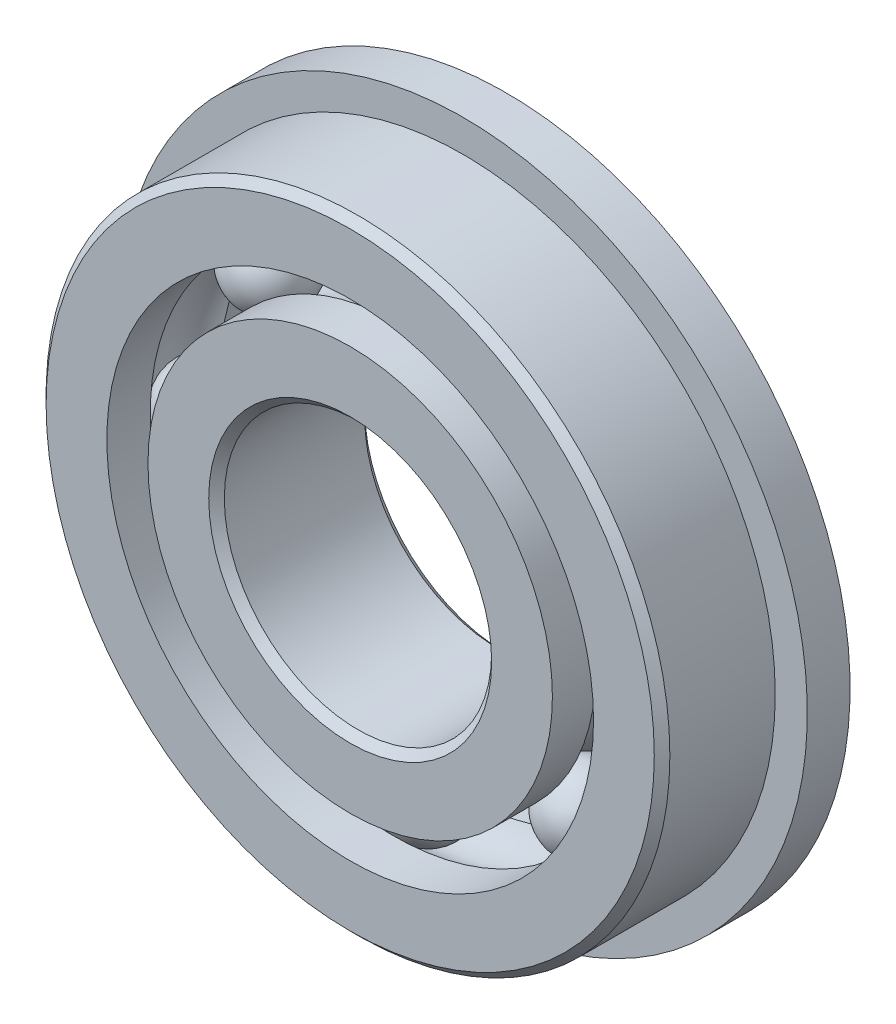
ISO-10303-21;
HEADER;
FILE_DESCRIPTION(('STEP AP214'),'2;1');
FILE_NAME('part.step','',(''),(''),'','','');
FILE_SCHEMA(('AUTOMOTIVE_DESIGN { 1 0 10303 214 1 1 1 1 }'));
ENDSEC;
DATA;
#1=APPLICATION_CONTEXT('core data for automotive mechanical design processes');
#2=APPLICATION_PROTOCOL_DEFINITION('international standard','automotive_design',2000,#1);
#3=PRODUCT_CONTEXT('',#1,'mechanical');
#4=PRODUCT('Part','Part','',(#3));
#5=PRODUCT_RELATED_PRODUCT_CATEGORY('part','',(#4));
#6=PRODUCT_DEFINITION_FORMATION('','',#4);
#7=PRODUCT_DEFINITION_CONTEXT('part definition',#1,'design');
#8=PRODUCT_DEFINITION('design','',#6,#7);
#9=PRODUCT_DEFINITION_SHAPE('','',#8);
#10=(LENGTH_UNIT() NAMED_UNIT(*) SI_UNIT(.MILLI.,.METRE.));
#11=(NAMED_UNIT(*) PLANE_ANGLE_UNIT() SI_UNIT($,.RADIAN.));
#12=(NAMED_UNIT(*) SI_UNIT($,.STERADIAN.) SOLID_ANGLE_UNIT());
#13=UNCERTAINTY_MEASURE_WITH_UNIT(LENGTH_MEASURE(1.E-05),#10,'distance_accuracy_value','');
#14=(GEOMETRIC_REPRESENTATION_CONTEXT(3) GLOBAL_UNCERTAINTY_ASSIGNED_CONTEXT((#13)) GLOBAL_UNIT_ASSIGNED_CONTEXT((#10,
#11,#12)) REPRESENTATION_CONTEXT('',''));
#15=CARTESIAN_POINT('',(0.,0.,0.));
#16=DIRECTION('',(0.,0.,1.));
#17=DIRECTION('',(1.,0.,0.));
#18=AXIS2_PLACEMENT_3D('',#15,#16,#17);
#19=CARTESIAN_POINT('',(-5.61266007566815,5.61266007566829,0.));
#20=DIRECTION('',(0.,0.,1.));
#21=DIRECTION('',(-0.707106781186539,0.707106781186556,0.));
#22=AXIS2_PLACEMENT_3D('',#19,#20,#21);
#23=SPHERICAL_SURFACE('',#22,1.43574962434293);
#24=CARTESIAN_POINT('',(-5.61266007566815,5.61266007566829,1.43574962434293));
#25=VERTEX_POINT('',#24);
#26=VERTEX_LOOP('',#25);
#27=FACE_BOUND('',#26,.T.);
#28=ADVANCED_FACE('F39',(#27),#23,.T.);
#29=CLOSED_SHELL('',(#28));
#30=MANIFOLD_SOLID_BREP('B2',#29);
#31=CARTESIAN_POINT('',(-7.9375,0.,0.));
#32=DIRECTION('',(0.,0.,1.));
#33=DIRECTION('',(-1.,0.,0.));
#34=AXIS2_PLACEMENT_3D('',#31,#32,#33);
#35=SPHERICAL_SURFACE('',#34,1.43574962434293);
#36=CARTESIAN_POINT('',(-7.9375,0.,1.43574962434293));
#37=VERTEX_POINT('',#36);
#38=VERTEX_LOOP('',#37);
#39=FACE_BOUND('',#38,.T.);
#40=ADVANCED_FACE('F59',(#39),#35,.T.);
#41=CLOSED_SHELL('',(#40));
#42=MANIFOLD_SOLID_BREP('B6',#41);
#43=CARTESIAN_POINT('',(-5.61266007566827,-5.61266007566817,0.));
#44=DIRECTION('',(0.,0.,1.));
#45=DIRECTION('',(-0.707106781186554,-0.707106781186541,0.));
#46=AXIS2_PLACEMENT_3D('',#43,#44,#45);
#47=SPHERICAL_SURFACE('',#46,1.43574962434293);
#48=CARTESIAN_POINT('',(-5.61266007566827,-5.61266007566817,1.43574962434293));
#49=VERTEX_POINT('',#48);
#50=VERTEX_LOOP('',#49);
#51=FACE_BOUND('',#50,.T.);
#52=ADVANCED_FACE('F79',(#51),#47,.T.);
#53=CLOSED_SHELL('',(#52));
#54=MANIFOLD_SOLID_BREP('B35',#53);
#55=CARTESIAN_POINT('',(0.,-7.9375,0.));
#56=DIRECTION('',(0.,0.,1.));
#57=DIRECTION('',(0.,-1.,0.));
#58=AXIS2_PLACEMENT_3D('',#55,#56,#57);
#59=SPHERICAL_SURFACE('',#58,1.43574962434293);
#60=CARTESIAN_POINT('',(0.,-7.9375,1.43574962434293));
#61=VERTEX_POINT('',#60);
#62=VERTEX_LOOP('',#61);
#63=FACE_BOUND('',#62,.T.);
#64=ADVANCED_FACE('F99',(#63),#59,.T.);
#65=CLOSED_SHELL('',(#64));
#66=MANIFOLD_SOLID_BREP('B55',#65);
#67=CARTESIAN_POINT('',(5.61266007566819,-5.61266007566825,0.));
#68=DIRECTION('',(0.,0.,1.));
#69=DIRECTION('',(0.707106781186544,-0.707106781186551,0.));
#70=AXIS2_PLACEMENT_3D('',#67,#68,#69);
#71=SPHERICAL_SURFACE('',#70,1.43574962434293);
#72=CARTESIAN_POINT('',(5.61266007566819,-5.61266007566825,1.43574962434293));
#73=VERTEX_POINT('',#72);
#74=VERTEX_LOOP('',#73);
#75=FACE_BOUND('',#74,.T.);
#76=ADVANCED_FACE('F119',(#75),#71,.T.);
#77=CLOSED_SHELL('',(#76));
#78=MANIFOLD_SOLID_BREP('B75',#77);
#79=CARTESIAN_POINT('',(7.9375,0.,0.));
#80=DIRECTION('',(0.,0.,1.));
#81=DIRECTION('',(1.,0.,0.));
#82=AXIS2_PLACEMENT_3D('',#79,#80,#81);
#83=SPHERICAL_SURFACE('',#82,1.43574962434293);
#84=CARTESIAN_POINT('',(7.9375,0.,1.43574962434293));
#85=VERTEX_POINT('',#84);
#86=VERTEX_LOOP('',#85);
#87=FACE_BOUND('',#86,.T.);
#88=ADVANCED_FACE('F139',(#87),#83,.T.);
#89=CLOSED_SHELL('',(#88));
#90=MANIFOLD_SOLID_BREP('B95',#89);
#91=CARTESIAN_POINT('',(5.61266007566823,5.61266007566821,0.));
#92=DIRECTION('',(0.,0.,1.));
#93=DIRECTION('',(0.707106781186549,0.707106781186546,0.));
#94=AXIS2_PLACEMENT_3D('',#91,#92,#93);
#95=SPHERICAL_SURFACE('',#94,1.43574962434293);
#96=CARTESIAN_POINT('',(5.61266007566823,5.61266007566821,1.43574962434293));
#97=VERTEX_POINT('',#96);
#98=VERTEX_LOOP('',#97);
#99=FACE_BOUND('',#98,.T.);
#100=ADVANCED_FACE('F159',(#99),#95,.T.);
#101=CLOSED_SHELL('',(#100));
#102=MANIFOLD_SOLID_BREP('B115',#101);
#103=CARTESIAN_POINT('',(0.,7.9375,0.));
#104=DIRECTION('',(0.,0.,1.));
#105=DIRECTION('',(0.,1.,0.));
#106=AXIS2_PLACEMENT_3D('',#103,#104,#105);
#107=SPHERICAL_SURFACE('',#106,1.43574962434293);
#108=CARTESIAN_POINT('',(0.,7.9375,1.43574962434293));
#109=VERTEX_POINT('',#108);
#110=VERTEX_LOOP('',#109);
#111=FACE_BOUND('',#110,.T.);
#112=ADVANCED_FACE('F181',(#111),#107,.T.);
#113=CLOSED_SHELL('',(#112));
#114=MANIFOLD_SOLID_BREP('B135',#113);
#115=CARTESIAN_POINT('',(0.,7.20480769230769,2.778125));
#116=DIRECTION('',(0.,0.,-1.));
#117=DIRECTION('',(-1.,0.,0.));
#118=AXIS2_PLACEMENT_3D('',#115,#116,#117);
#119=PLANE('',#118);
#120=CARTESIAN_POINT('',(0.,0.,2.778125));
#121=DIRECTION('',(0.,0.,1.));
#122=DIRECTION('',(1.,0.,0.));
#123=AXIS2_PLACEMENT_3D('',#120,#121,#122);
#124=CIRCLE('',#123,5.0403125);
#125=CARTESIAN_POINT('',(5.0403125,0.,2.778125));
#126=VERTEX_POINT('',#125);
#127=EDGE_CURVE('E228',#126,#126,#124,.T.);
#128=ORIENTED_EDGE('',*,*,#127,.F.);
#129=EDGE_LOOP('',(#128));
#130=FACE_BOUND('',#129,.T.);
#131=CARTESIAN_POINT('',(0.,0.,2.778125));
#132=DIRECTION('',(0.,0.,1.));
#133=DIRECTION('',(1.,0.,0.));
#134=AXIS2_PLACEMENT_3D('',#131,#132,#133);
#135=CIRCLE('',#134,7.20480769230769);
#136=CARTESIAN_POINT('',(7.20480769230769,0.,2.778125));
#137=VERTEX_POINT('',#136);
#138=EDGE_CURVE('E180',#137,#137,#135,.T.);
#139=ORIENTED_EDGE('',*,*,#138,.T.);
#140=EDGE_LOOP('',(#139));
#141=FACE_BOUND('',#140,.T.);
#142=ADVANCED_FACE('F200',(#130,#141),#119,.F.);
#143=CARTESIAN_POINT('',(0.,0.,2.778125));
#144=DIRECTION('',(0.,0.,1.));
#145=DIRECTION('',(1.,0.,0.));
#146=AXIS2_PLACEMENT_3D('',#143,#144,#145);
#147=CYLINDRICAL_SURFACE('',#146,7.20480769230769);
#148=ORIENTED_EDGE('',*,*,#138,.F.);
#149=EDGE_LOOP('',(#148));
#150=FACE_BOUND('',#149,.T.);
#151=CARTESIAN_POINT('',(0.,0.,1.23472222222222));
#152=DIRECTION('',(0.,0.,1.));
#153=DIRECTION('',(1.,0.,0.));
#154=AXIS2_PLACEMENT_3D('',#151,#152,#153);
#155=CIRCLE('',#154,7.20480769230769);
#156=CARTESIAN_POINT('',(7.20480769230769,0.,1.23472222222222));
#157=VERTEX_POINT('',#156);
#158=EDGE_CURVE('E206',#157,#157,#155,.T.);
#159=ORIENTED_EDGE('',*,*,#158,.T.);
#160=EDGE_LOOP('',(#159));
#161=FACE_BOUND('',#160,.T.);
#162=ADVANCED_FACE('F235',(#150,#161),#147,.T.);
#163=CARTESIAN_POINT('',(0.,0.,0.));
#164=DIRECTION('',(0.,0.,1.));
#165=DIRECTION('',(1.,0.,0.));
#166=AXIS2_PLACEMENT_3D('',#163,#164,#165);
#167=TOROIDAL_SURFACE('',#166,7.93749999999999,1.43574962434293);
#168=ORIENTED_EDGE('',*,*,#158,.F.);
#169=EDGE_LOOP('',(#168));
#170=FACE_BOUND('',#169,.T.);
#171=CARTESIAN_POINT('',(0.,0.,-1.23472222222222));
#172=DIRECTION('',(0.,0.,1.));
#173=DIRECTION('',(1.,0.,0.));
#174=AXIS2_PLACEMENT_3D('',#171,#172,#173);
#175=CIRCLE('',#174,7.20480769230769);
#176=CARTESIAN_POINT('',(7.20480769230769,0.,-1.23472222222222));
#177=VERTEX_POINT('',#176);
#178=EDGE_CURVE('E210',#177,#177,#175,.T.);
#179=ORIENTED_EDGE('',*,*,#178,.T.);
#180=EDGE_LOOP('',(#179));
#181=FACE_BOUND('',#180,.T.);
#182=ADVANCED_FACE('F239',(#170,#181),#167,.F.);
#183=CARTESIAN_POINT('',(0.,0.,2.778125));
#184=DIRECTION('',(0.,0.,1.));
#185=DIRECTION('',(1.,0.,0.));
#186=AXIS2_PLACEMENT_3D('',#183,#184,#185);
#187=CYLINDRICAL_SURFACE('',#186,7.20480769230769);
#188=ORIENTED_EDGE('',*,*,#178,.F.);
#189=EDGE_LOOP('',(#188));
#190=FACE_BOUND('',#189,.T.);
#191=CARTESIAN_POINT('',(0.,0.,-2.778125));
#192=DIRECTION('',(0.,0.,1.));
#193=DIRECTION('',(1.,0.,0.));
#194=AXIS2_PLACEMENT_3D('',#191,#192,#193);
#195=CIRCLE('',#194,7.20480769230769);
#196=CARTESIAN_POINT('',(7.20480769230769,0.,-2.778125));
#197=VERTEX_POINT('',#196);
#198=EDGE_CURVE('E214',#197,#197,#195,.T.);
#199=ORIENTED_EDGE('',*,*,#198,.T.);
#200=EDGE_LOOP('',(#199));
#201=FACE_BOUND('',#200,.T.);
#202=ADVANCED_FACE('F244',(#190,#201),#187,.T.);
#203=CARTESIAN_POINT('',(0.,5.0403125,-2.778125));
#204=DIRECTION('',(0.,0.,1.));
#205=DIRECTION('',(1.,0.,0.));
#206=AXIS2_PLACEMENT_3D('',#203,#204,#205);
#207=PLANE('',#206);
#208=ORIENTED_EDGE('',*,*,#198,.F.);
#209=EDGE_LOOP('',(#208));
#210=FACE_BOUND('',#209,.T.);
#211=CARTESIAN_POINT('',(0.,0.,-2.778125));
#212=DIRECTION('',(0.,0.,1.));
#213=DIRECTION('',(1.,0.,0.));
#214=AXIS2_PLACEMENT_3D('',#211,#212,#213);
#215=CIRCLE('',#214,5.0403125);
#216=CARTESIAN_POINT('',(5.0403125,0.,-2.778125));
#217=VERTEX_POINT('',#216);
#218=EDGE_CURVE('E219',#217,#217,#215,.T.);
#219=ORIENTED_EDGE('',*,*,#218,.T.);
#220=EDGE_LOOP('',(#219));
#221=FACE_BOUND('',#220,.T.);
#222=ADVANCED_FACE('F250',(#210,#221),#207,.F.);
#223=CARTESIAN_POINT('',(0.,0.,-2.5003125));
#224=DIRECTION('',(0.,0.,-1.));
#225=DIRECTION('',(-1.,0.,0.));
#226=AXIS2_PLACEMENT_3D('',#223,#224,#225);
#227=CONICAL_SURFACE('',#226,4.7625,0.785398163397442);
#228=ORIENTED_EDGE('',*,*,#218,.F.);
#229=EDGE_LOOP('',(#228));
#230=FACE_BOUND('',#229,.T.);
#231=CARTESIAN_POINT('',(0.,0.,-2.5003125));
#232=DIRECTION('',(0.,0.,1.));
#233=DIRECTION('',(1.,0.,0.));
#234=AXIS2_PLACEMENT_3D('',#231,#232,#233);
#235=CIRCLE('',#234,4.7625);
#236=CARTESIAN_POINT('',(4.7625,0.,-2.5003125));
#237=VERTEX_POINT('',#236);
#238=EDGE_CURVE('E222',#237,#237,#235,.T.);
#239=ORIENTED_EDGE('',*,*,#238,.T.);
#240=EDGE_LOOP('',(#239));
#241=FACE_BOUND('',#240,.T.);
#242=ADVANCED_FACE('F254',(#230,#241),#227,.F.);
#243=CARTESIAN_POINT('',(0.,0.,2.778125));
#244=DIRECTION('',(0.,0.,1.));
#245=DIRECTION('',(1.,0.,0.));
#246=AXIS2_PLACEMENT_3D('',#243,#244,#245);
#247=CYLINDRICAL_SURFACE('',#246,4.7625);
#248=ORIENTED_EDGE('',*,*,#238,.F.);
#249=EDGE_LOOP('',(#248));
#250=FACE_BOUND('',#249,.T.);
#251=CARTESIAN_POINT('',(0.,0.,2.5003125));
#252=DIRECTION('',(0.,0.,1.));
#253=DIRECTION('',(1.,0.,0.));
#254=AXIS2_PLACEMENT_3D('',#251,#252,#253);
#255=CIRCLE('',#254,4.7625);
#256=CARTESIAN_POINT('',(4.7625,0.,2.5003125));
#257=VERTEX_POINT('',#256);
#258=EDGE_CURVE('E225',#257,#257,#255,.T.);
#259=ORIENTED_EDGE('',*,*,#258,.T.);
#260=EDGE_LOOP('',(#259));
#261=FACE_BOUND('',#260,.T.);
#262=ADVANCED_FACE('F258',(#250,#261),#247,.F.);
#263=CARTESIAN_POINT('',(0.,0.,2.778125));
#264=DIRECTION('',(0.,0.,1.));
#265=DIRECTION('',(1.,0.,0.));
#266=AXIS2_PLACEMENT_3D('',#263,#264,#265);
#267=CONICAL_SURFACE('',#266,5.0403125,0.785398163397453);
#268=ORIENTED_EDGE('',*,*,#258,.F.);
#269=EDGE_LOOP('',(#268));
#270=FACE_BOUND('',#269,.T.);
#271=ORIENTED_EDGE('',*,*,#127,.T.);
#272=EDGE_LOOP('',(#271));
#273=FACE_BOUND('',#272,.T.);
#274=ADVANCED_FACE('F232',(#270,#273),#267,.F.);
#275=CLOSED_SHELL('',(#142,#162,#182,#202,#222,#242,#262,#274));
#276=MANIFOLD_SOLID_BREP('B155',#275);
#277=CARTESIAN_POINT('',(0.,0.,2.5003125));
#278=DIRECTION('',(0.,0.,-1.));
#279=DIRECTION('',(-1.,0.,0.));
#280=AXIS2_PLACEMENT_3D('',#277,#278,#279);
#281=CONICAL_SURFACE('',#280,11.1125,0.785398163397446);
#282=CARTESIAN_POINT('',(0.,0.,2.778125));
#283=DIRECTION('',(0.,0.,1.));
#284=DIRECTION('',(1.,0.,0.));
#285=AXIS2_PLACEMENT_3D('',#282,#283,#284);
#286=CIRCLE('',#285,10.8346875);
#287=CARTESIAN_POINT('',(10.8346875,0.,2.778125));
#288=VERTEX_POINT('',#287);
#289=EDGE_CURVE('E343',#288,#288,#286,.T.);
#290=ORIENTED_EDGE('',*,*,#289,.F.);
#291=EDGE_LOOP('',(#290));
#292=FACE_BOUND('',#291,.T.);
#293=CARTESIAN_POINT('',(0.,0.,2.5003125));
#294=DIRECTION('',(0.,0.,1.));
#295=DIRECTION('',(1.,0.,0.));
#296=AXIS2_PLACEMENT_3D('',#293,#294,#295);
#297=CIRCLE('',#296,11.1125);
#298=CARTESIAN_POINT('',(11.1125,0.,2.5003125));
#299=VERTEX_POINT('',#298);
#300=EDGE_CURVE('E199',#299,#299,#297,.T.);
#301=ORIENTED_EDGE('',*,*,#300,.T.);
#302=EDGE_LOOP('',(#301));
#303=FACE_BOUND('',#302,.T.);
#304=ADVANCED_FACE('F321',(#292,#303),#281,.T.);
#305=CARTESIAN_POINT('',(0.,0.,2.778125));
#306=DIRECTION('',(0.,0.,1.));
#307=DIRECTION('',(1.,0.,0.));
#308=AXIS2_PLACEMENT_3D('',#305,#306,#307);
#309=CYLINDRICAL_SURFACE('',#308,11.1125);
#310=CARTESIAN_POINT('',(0.,0.,-1.254125));
#311=DIRECTION('',(0.,0.,1.));
#312=DIRECTION('',(1.,0.,0.));
#313=AXIS2_PLACEMENT_3D('',#310,#311,#312);
#314=CIRCLE('',#313,11.1125);
#315=CARTESIAN_POINT('',(11.1125,0.,-1.254125));
#316=VERTEX_POINT('',#315);
#317=EDGE_CURVE('E346',#316,#316,#314,.T.);
#318=ORIENTED_EDGE('',*,*,#317,.T.);
#319=EDGE_LOOP('',(#318));
#320=FACE_BOUND('',#319,.T.);
#321=ORIENTED_EDGE('',*,*,#300,.F.);
#322=EDGE_LOOP('',(#321));
#323=FACE_BOUND('',#322,.T.);
#324=ADVANCED_FACE('F366',(#320,#323),#309,.T.);
#325=CARTESIAN_POINT('',(0.,10.8346875,-2.778125));
#326=DIRECTION('',(0.,0.,1.));
#327=DIRECTION('',(1.,0.,0.));
#328=AXIS2_PLACEMENT_3D('',#325,#326,#327);
#329=PLANE('',#328);
#330=CARTESIAN_POINT('',(0.,0.,-2.778125));
#331=DIRECTION('',(0.,0.,1.));
#332=DIRECTION('',(1.,0.,0.));
#333=AXIS2_PLACEMENT_3D('',#330,#331,#332);
#334=CIRCLE('',#333,8.67019230769231);
#335=CARTESIAN_POINT('',(8.67019230769231,0.,-2.778125));
#336=VERTEX_POINT('',#335);
#337=EDGE_CURVE('E327',#336,#336,#334,.T.);
#338=ORIENTED_EDGE('',*,*,#337,.T.);
#339=EDGE_LOOP('',(#338));
#340=FACE_BOUND('',#339,.T.);
#341=CARTESIAN_POINT('',(0.,0.,-2.778125));
#342=DIRECTION('',(0.,0.,-1.));
#343=DIRECTION('',(-1.,0.,0.));
#344=AXIS2_PLACEMENT_3D('',#341,#342,#343);
#345=CIRCLE('',#344,12.2555);
#346=CARTESIAN_POINT('',(-12.2555,0.,-2.778125));
#347=VERTEX_POINT('',#346);
#348=EDGE_CURVE('E349',#347,#347,#345,.T.);
#349=ORIENTED_EDGE('',*,*,#348,.T.);
#350=EDGE_LOOP('',(#349));
#351=FACE_BOUND('',#350,.T.);
#352=ADVANCED_FACE('F369',(#340,#351),#329,.F.);
#353=CARTESIAN_POINT('',(0.,0.,2.778125));
#354=DIRECTION('',(0.,0.,1.));
#355=DIRECTION('',(1.,0.,0.));
#356=AXIS2_PLACEMENT_3D('',#353,#354,#355);
#357=CYLINDRICAL_SURFACE('',#356,8.67019230769231);
#358=CARTESIAN_POINT('',(0.,0.,-1.23472222222222));
#359=DIRECTION('',(0.,0.,1.));
#360=DIRECTION('',(1.,0.,0.));
#361=AXIS2_PLACEMENT_3D('',#358,#359,#360);
#362=CIRCLE('',#361,8.67019230769231);
#363=CARTESIAN_POINT('',(8.67019230769231,0.,-1.23472222222222));
#364=VERTEX_POINT('',#363);
#365=EDGE_CURVE('E331',#364,#364,#362,.T.);
#366=ORIENTED_EDGE('',*,*,#365,.T.);
#367=EDGE_LOOP('',(#366));
#368=FACE_BOUND('',#367,.T.);
#369=ORIENTED_EDGE('',*,*,#337,.F.);
#370=EDGE_LOOP('',(#369));
#371=FACE_BOUND('',#370,.T.);
#372=ADVANCED_FACE('F374',(#368,#371),#357,.F.);
#373=CARTESIAN_POINT('',(0.,0.,0.));
#374=DIRECTION('',(0.,0.,1.));
#375=DIRECTION('',(1.,0.,0.));
#376=AXIS2_PLACEMENT_3D('',#373,#374,#375);
#377=TOROIDAL_SURFACE('',#376,7.9375,1.43574962434293);
#378=ORIENTED_EDGE('',*,*,#365,.F.);
#379=EDGE_LOOP('',(#378));
#380=FACE_BOUND('',#379,.T.);
#381=CARTESIAN_POINT('',(0.,0.,1.23472222222222));
#382=DIRECTION('',(0.,0.,1.));
#383=DIRECTION('',(1.,0.,0.));
#384=AXIS2_PLACEMENT_3D('',#381,#382,#383);
#385=CIRCLE('',#384,8.67019230769231);
#386=CARTESIAN_POINT('',(8.67019230769231,0.,1.23472222222222));
#387=VERTEX_POINT('',#386);
#388=EDGE_CURVE('E335',#387,#387,#385,.T.);
#389=ORIENTED_EDGE('',*,*,#388,.T.);
#390=EDGE_LOOP('',(#389));
#391=FACE_BOUND('',#390,.T.);
#392=ADVANCED_FACE('F380',(#380,#391),#377,.F.);
#393=CARTESIAN_POINT('',(0.,0.,2.778125));
#394=DIRECTION('',(0.,0.,1.));
#395=DIRECTION('',(1.,0.,0.));
#396=AXIS2_PLACEMENT_3D('',#393,#394,#395);
#397=CYLINDRICAL_SURFACE('',#396,8.67019230769231);
#398=ORIENTED_EDGE('',*,*,#388,.F.);
#399=EDGE_LOOP('',(#398));
#400=FACE_BOUND('',#399,.T.);
#401=CARTESIAN_POINT('',(0.,0.,2.778125));
#402=DIRECTION('',(0.,0.,1.));
#403=DIRECTION('',(1.,0.,0.));
#404=AXIS2_PLACEMENT_3D('',#401,#402,#403);
#405=CIRCLE('',#404,8.67019230769231);
#406=CARTESIAN_POINT('',(8.67019230769231,0.,2.778125));
#407=VERTEX_POINT('',#406);
#408=EDGE_CURVE('E340',#407,#407,#405,.T.);
#409=ORIENTED_EDGE('',*,*,#408,.T.);
#410=EDGE_LOOP('',(#409));
#411=FACE_BOUND('',#410,.T.);
#412=ADVANCED_FACE('F384',(#400,#411),#397,.F.);
#413=CARTESIAN_POINT('',(0.,10.8346875,2.778125));
#414=DIRECTION('',(0.,0.,-1.));
#415=DIRECTION('',(-1.,0.,0.));
#416=AXIS2_PLACEMENT_3D('',#413,#414,#415);
#417=PLANE('',#416);
#418=ORIENTED_EDGE('',*,*,#408,.F.);
#419=EDGE_LOOP('',(#418));
#420=FACE_BOUND('',#419,.T.);
#421=ORIENTED_EDGE('',*,*,#289,.T.);
#422=EDGE_LOOP('',(#421));
#423=FACE_BOUND('',#422,.T.);
#424=ADVANCED_FACE('F362',(#420,#423),#417,.F.);
#425=CARTESIAN_POINT('',(0.,8.67019230769231,-1.254125));
#426=DIRECTION('',(0.,0.,1.));
#427=DIRECTION('',(1.,0.,0.));
#428=AXIS2_PLACEMENT_3D('',#425,#426,#427);
#429=PLANE('',#428);
#430=CARTESIAN_POINT('',(0.,0.,-1.254125));
#431=DIRECTION('',(0.,0.,-1.));
#432=DIRECTION('',(-1.,0.,0.));
#433=AXIS2_PLACEMENT_3D('',#430,#431,#432);
#434=CIRCLE('',#433,12.2555);
#435=CARTESIAN_POINT('',(-12.2555,0.,-1.254125));
#436=VERTEX_POINT('',#435);
#437=EDGE_CURVE('E352',#436,#436,#434,.T.);
#438=ORIENTED_EDGE('',*,*,#437,.F.);
#439=EDGE_LOOP('',(#438));
#440=FACE_BOUND('',#439,.T.);
#441=ORIENTED_EDGE('',*,*,#317,.F.);
#442=EDGE_LOOP('',(#441));
#443=FACE_BOUND('',#442,.T.);
#444=ADVANCED_FACE('F359',(#440,#443),#429,.T.);
#445=CARTESIAN_POINT('',(0.,0.,-2.778125));
#446=DIRECTION('',(0.,0.,-1.));
#447=DIRECTION('',(-1.,0.,0.));
#448=AXIS2_PLACEMENT_3D('',#445,#446,#447);
#449=CYLINDRICAL_SURFACE('',#448,12.2555);
#450=ORIENTED_EDGE('',*,*,#437,.T.);
#451=EDGE_LOOP('',(#450));
#452=FACE_BOUND('',#451,.T.);
#453=ORIENTED_EDGE('',*,*,#348,.F.);
#454=EDGE_LOOP('',(#453));
#455=FACE_BOUND('',#454,.T.);
#456=ADVANCED_FACE('F356',(#452,#455),#449,.T.);
#457=CLOSED_SHELL('',(#304,#324,#352,#372,#392,#412,#424,#444,#456));
#458=MANIFOLD_SOLID_BREP('B175',#457);
#459=ADVANCED_BREP_SHAPE_REPRESENTATION('',(#18,#30,#42,#54,#66,#78,#90,#102,#114,#276,#458),#14);
#460=SHAPE_DEFINITION_REPRESENTATION(#9,#459);
ENDSEC;
END-ISO-10303-21;
